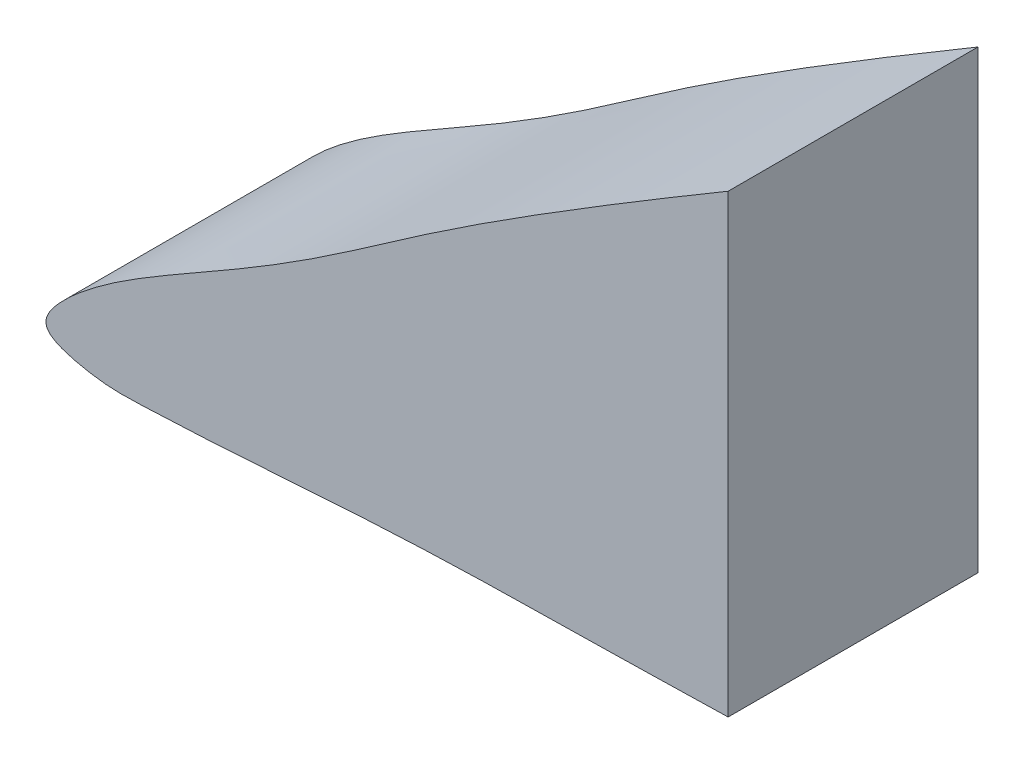
ISO-10303-21;
HEADER;
FILE_DESCRIPTION(('STEP AP214'),'2;1');
FILE_NAME('part.step','',(''),(''),'','','');
FILE_SCHEMA(('AUTOMOTIVE_DESIGN { 1 0 10303 214 1 1 1 1 }'));
ENDSEC;
DATA;
#1=APPLICATION_CONTEXT('core data for automotive mechanical design processes');
#2=APPLICATION_PROTOCOL_DEFINITION('international standard','automotive_design',2000,#1);
#3=PRODUCT_CONTEXT('',#1,'mechanical');
#4=PRODUCT('Part','Part','',(#3));
#5=PRODUCT_RELATED_PRODUCT_CATEGORY('part','',(#4));
#6=PRODUCT_DEFINITION_FORMATION('','',#4);
#7=PRODUCT_DEFINITION_CONTEXT('part definition',#1,'design');
#8=PRODUCT_DEFINITION('design','',#6,#7);
#9=PRODUCT_DEFINITION_SHAPE('','',#8);
#10=(LENGTH_UNIT() NAMED_UNIT(*) SI_UNIT(.MILLI.,.METRE.));
#11=(NAMED_UNIT(*) PLANE_ANGLE_UNIT() SI_UNIT($,.RADIAN.));
#12=(NAMED_UNIT(*) SI_UNIT($,.STERADIAN.) SOLID_ANGLE_UNIT());
#13=UNCERTAINTY_MEASURE_WITH_UNIT(LENGTH_MEASURE(1.E-05),#10,'distance_accuracy_value','');
#14=(GEOMETRIC_REPRESENTATION_CONTEXT(3) GLOBAL_UNCERTAINTY_ASSIGNED_CONTEXT((#13)) GLOBAL_UNIT_ASSIGNED_CONTEXT((#10,
#11,#12)) REPRESENTATION_CONTEXT('',''));
#15=CARTESIAN_POINT('',(0.,0.,0.));
#16=DIRECTION('',(0.,0.,1.));
#17=DIRECTION('',(1.,0.,0.));
#18=AXIS2_PLACEMENT_3D('',#15,#16,#17);
#19=CARTESIAN_POINT('',(-64.0491892275269,-108.941956320283,59.9999999999997));
#20=CARTESIAN_POINT('',(-64.916814073584,-109.453491194074,59.9999999999997));
#21=CARTESIAN_POINT('',(-65.7813275878161,-109.969977799597,59.9999999999997));
#22=CARTESIAN_POINT('',(-67.5059803143799,-111.00991277838,59.9999999999997));
#23=CARTESIAN_POINT('',(-68.3658374650965,-111.533810056975,59.9999999999997));
#24=CARTESIAN_POINT('',(-70.077149004939,-112.594977736525,59.9999999999997));
#25=CARTESIAN_POINT('',(-70.9285996781756,-113.132254051375,59.9999999999997));
#26=CARTESIAN_POINT('',(-72.6186735071897,-114.227221869428,59.9999999999997));
#27=CARTESIAN_POINT('',(-73.4561361562248,-114.786760336692,59.9999999999997));
#28=CARTESIAN_POINT('',(-75.113512478323,-115.933766732321,59.9999999999997));
#29=CARTESIAN_POINT('',(-75.936327199912,-116.516508625601,59.9999999999997));
#30=CARTESIAN_POINT('',(-77.6085762756817,-117.640547366462,59.9999999999997));
#31=CARTESIAN_POINT('',(-78.4593205614324,-118.179866972095,59.9999999999997));
#32=CARTESIAN_POINT('',(-80.1897537733933,-119.21356446914,59.9999999999997));
#33=CARTESIAN_POINT('',(-81.0710976002097,-119.705122828762,59.9999999999997));
#34=CARTESIAN_POINT('',(-82.3775778295748,-120.466978939285,59.9999999999997));
#35=CARTESIAN_POINT('',(-82.8103361921758,-120.725289274037,59.9999999999997));
#36=CARTESIAN_POINT('',(-83.6592446702396,-121.268375186674,59.9999999999997));
#37=CARTESIAN_POINT('',(-84.0754865345503,-121.553004562763,59.9999999999997));
#38=CARTESIAN_POINT('',(-84.6737184874888,-122.021588128134,59.9999999999997));
#39=CARTESIAN_POINT('',(-84.8703679468466,-122.182939407663,59.9999999999997));
#40=CARTESIAN_POINT('',(-85.1510311936891,-122.438363205277,59.9999999999997));
#41=CARTESIAN_POINT('',(-85.2424660005515,-122.525653926869,59.9999999999997));
#42=CARTESIAN_POINT('',(-85.4206592566678,-122.704977577126,59.9999999999997));
#43=CARTESIAN_POINT('',(-85.5078078528504,-122.796614865064,59.9999999999997));
#44=CARTESIAN_POINT('',(-85.6705924448503,-122.991564154349,59.9999999999997));
#45=CARTESIAN_POINT('',(-85.7473201590252,-123.095376469857,59.9999999999997));
#46=CARTESIAN_POINT('',(-85.8376425837549,-123.263504927186,59.9999999999997));
#47=CARTESIAN_POINT('',(-85.8637721744491,-123.323051186106,59.9999999999997));
#48=CARTESIAN_POINT('',(-85.8936989115167,-123.447832598768,59.9999999999997));
#49=CARTESIAN_POINT('',(-85.8966335226402,-123.514140200892,59.9999999999997));
#50=CARTESIAN_POINT('',(-85.8623586589721,-123.638423954834,59.9999999999997));
#51=CARTESIAN_POINT('',(-85.8249309001778,-123.693987859988,59.9999999999997));
#52=CARTESIAN_POINT('',(-85.7341024403552,-123.784642841872,59.9999999999997));
#53=CARTESIAN_POINT('',(-85.6804287747307,-123.821727387187,59.9999999999997));
#54=CARTESIAN_POINT('',(-85.5149462709032,-123.918656347732,59.9999999999997));
#55=CARTESIAN_POINT('',(-85.396125066846,-123.965158764815,59.9999999999997));
#56=CARTESIAN_POINT('',(-85.0315748969899,-124.08703717668,59.9999999999997));
#57=CARTESIAN_POINT('',(-84.7824685177842,-124.141857592444,59.9999999999997));
#58=CARTESIAN_POINT('',(-84.2793684815052,-124.230227014204,59.9999999999997));
#59=CARTESIAN_POINT('',(-84.0257091889579,-124.261149537343,59.9999999999997));
#60=CARTESIAN_POINT('',(-83.5200958548092,-124.286085759742,59.9999999999997));
#61=CARTESIAN_POINT('',(-83.2672745269978,-124.281585487117,59.9999999999997));
#62=CARTESIAN_POINT('',(-82.761626016437,-124.265808418186,59.9999999999997));
#63=CARTESIAN_POINT('',(-82.508799109645,-124.254851015614,59.9999999999997));
#64=CARTESIAN_POINT('',(-81.2446651554317,-124.200735003958,59.9999999999997));
#65=CARTESIAN_POINT('',(-80.2335329201732,-124.145332867247,59.9999999999997));
#66=CARTESIAN_POINT('',(-78.2133398074332,-124.00719022459,59.9999999999997));
#67=CARTESIAN_POINT('',(-77.2037237920855,-123.930073191889,59.9999999999997));
#68=CARTESIAN_POINT('',(-75.1826080755178,-123.807377730152,59.9999999999997));
#69=CARTESIAN_POINT('',(-74.1711395759086,-123.759161192513,59.9999999999997));
#70=CARTESIAN_POINT('',(-72.1473051377897,-123.687981536664,59.9999999999997));
#71=CARTESIAN_POINT('',(-71.1350977170758,-123.66487524093,59.9999999999997));
#72=CARTESIAN_POINT('',(-69.1104865151344,-123.627109440707,59.9999999999997));
#73=CARTESIAN_POINT('',(-68.0980884825346,-123.612202648936,59.9999999999997));
#74=CARTESIAN_POINT('',(-66.0735260712704,-123.572338032324,59.9999999999997));
#75=CARTESIAN_POINT('',(-65.06134455714,-123.548117319549,59.9999999999997));
#76=CARTESIAN_POINT('',(-64.0491892275145,-123.522770234457,59.9999999999997));
#77=B_SPLINE_CURVE_WITH_KNOTS('',3,(#19,#20,#21,#22,#23,#24,#25,#26,#27,#28,#29,#30,#31,#32,#33,
#34,#35,#36,#37,#38,#39,#40,#41,#42,#43,#44,#45,#46,#47,#48,#49,#50,#51,#52,#53,#54,#55,#56,#57,
#58,#59,#60,#61,#62,#63,#64,#65,#66,#67,#68,#69,#70,#71,#72,#73,#74,#75,#76),.UNSPECIFIED.,.F.,
.F.,(4,2,2,2,2,2,2,2,2,2,2,2,2,2,2,2,2,2,2,2,2,2,2,2,2,2,2,2,4),(0.,0.0624999999999942,
0.124999999999989,0.187499999999983,0.249999999999977,0.312499999999971,0.374999999999966,
0.43749999999996,0.468749999999957,0.499999999999954,0.515624999999953,0.523437499999952,
0.531249999999952,0.539062499999952,0.542968749999952,0.546874999999952,0.550781249999952,
0.554687499999952,0.562499999999952,0.578124999999954,0.593749999999955,0.609374999999956,
0.624999999999958,0.687499999999965,0.749999999999972,0.812499999999979,0.874999999999986,
0.937499999999993,1.),.UNSPECIFIED.);
#78=DIRECTION('',(0.,0.,-1.));
#79=VECTOR('',#78,1.);
#80=SURFACE_OF_LINEAR_EXTRUSION('',#77,#79);
#81=CARTESIAN_POINT('',(-64.0491892275269,-108.941956320283,51.9999999999998));
#82=CARTESIAN_POINT('',(-64.916814073584,-109.453491194074,51.9999999999998));
#83=CARTESIAN_POINT('',(-65.7813275878161,-109.969977799597,51.9999999999998));
#84=CARTESIAN_POINT('',(-67.5059803143799,-111.00991277838,51.9999999999998));
#85=CARTESIAN_POINT('',(-68.3658374650965,-111.533810056975,51.9999999999998));
#86=CARTESIAN_POINT('',(-70.077149004939,-112.594977736525,51.9999999999998));
#87=CARTESIAN_POINT('',(-70.9285996781756,-113.132254051375,51.9999999999998));
#88=CARTESIAN_POINT('',(-72.6186735071897,-114.227221869428,51.9999999999998));
#89=CARTESIAN_POINT('',(-73.4561361562248,-114.786760336692,51.9999999999998));
#90=CARTESIAN_POINT('',(-75.113512478323,-115.933766732321,51.9999999999998));
#91=CARTESIAN_POINT('',(-75.936327199912,-116.516508625601,51.9999999999998));
#92=CARTESIAN_POINT('',(-77.6085762756817,-117.640547366462,51.9999999999998));
#93=CARTESIAN_POINT('',(-78.4593205614324,-118.179866972095,51.9999999999998));
#94=CARTESIAN_POINT('',(-80.1897537733933,-119.21356446914,51.9999999999998));
#95=CARTESIAN_POINT('',(-81.0710976002097,-119.705122828762,51.9999999999998));
#96=CARTESIAN_POINT('',(-82.3775778295748,-120.466978939285,51.9999999999998));
#97=CARTESIAN_POINT('',(-82.8103361921758,-120.725289274037,51.9999999999998));
#98=CARTESIAN_POINT('',(-83.6592446702396,-121.268375186674,51.9999999999998));
#99=CARTESIAN_POINT('',(-84.0754865345503,-121.553004562763,51.9999999999998));
#100=CARTESIAN_POINT('',(-84.6737184874888,-122.021588128134,51.9999999999998));
#101=CARTESIAN_POINT('',(-84.8703679468466,-122.182939407663,51.9999999999998));
#102=CARTESIAN_POINT('',(-85.1510311936891,-122.438363205277,51.9999999999998));
#103=CARTESIAN_POINT('',(-85.2424660005515,-122.525653926869,51.9999999999998));
#104=CARTESIAN_POINT('',(-85.4206592566678,-122.704977577126,51.9999999999998));
#105=CARTESIAN_POINT('',(-85.5078078528504,-122.796614865064,51.9999999999998));
#106=CARTESIAN_POINT('',(-85.6705924448503,-122.991564154349,51.9999999999998));
#107=CARTESIAN_POINT('',(-85.7473201590252,-123.095376469857,51.9999999999998));
#108=CARTESIAN_POINT('',(-85.8376425837549,-123.263504927186,51.9999999999998));
#109=CARTESIAN_POINT('',(-85.8637721744491,-123.323051186106,51.9999999999998));
#110=CARTESIAN_POINT('',(-85.8936989115167,-123.447832598768,51.9999999999998));
#111=CARTESIAN_POINT('',(-85.8966335226402,-123.514140200892,51.9999999999998));
#112=CARTESIAN_POINT('',(-85.8623586589721,-123.638423954834,51.9999999999998));
#113=CARTESIAN_POINT('',(-85.8249309001778,-123.693987859988,51.9999999999998));
#114=CARTESIAN_POINT('',(-85.7341024403552,-123.784642841872,51.9999999999998));
#115=CARTESIAN_POINT('',(-85.6804287747307,-123.821727387187,51.9999999999998));
#116=CARTESIAN_POINT('',(-85.5149462709032,-123.918656347732,51.9999999999998));
#117=CARTESIAN_POINT('',(-85.396125066846,-123.965158764815,51.9999999999998));
#118=CARTESIAN_POINT('',(-85.0315748969899,-124.08703717668,51.9999999999998));
#119=CARTESIAN_POINT('',(-84.7824685177842,-124.141857592444,51.9999999999998));
#120=CARTESIAN_POINT('',(-84.2793684815052,-124.230227014204,51.9999999999998));
#121=CARTESIAN_POINT('',(-84.0257091889579,-124.261149537343,51.9999999999998));
#122=CARTESIAN_POINT('',(-83.5200958548092,-124.286085759742,51.9999999999998));
#123=CARTESIAN_POINT('',(-83.2672745269978,-124.281585487117,51.9999999999998));
#124=CARTESIAN_POINT('',(-82.761626016437,-124.265808418186,51.9999999999998));
#125=CARTESIAN_POINT('',(-82.508799109645,-124.254851015614,51.9999999999998));
#126=CARTESIAN_POINT('',(-81.2446651554317,-124.200735003958,51.9999999999998));
#127=CARTESIAN_POINT('',(-80.2335329201732,-124.145332867247,51.9999999999998));
#128=CARTESIAN_POINT('',(-78.2133398074332,-124.00719022459,51.9999999999998));
#129=CARTESIAN_POINT('',(-77.2037237920855,-123.930073191889,51.9999999999998));
#130=CARTESIAN_POINT('',(-75.1826080755178,-123.807377730152,51.9999999999998));
#131=CARTESIAN_POINT('',(-74.1711395759086,-123.759161192513,51.9999999999998));
#132=CARTESIAN_POINT('',(-72.1473051377897,-123.687981536664,51.9999999999998));
#133=CARTESIAN_POINT('',(-71.1350977170758,-123.66487524093,51.9999999999998));
#134=CARTESIAN_POINT('',(-69.1104865151344,-123.627109440707,51.9999999999998));
#135=CARTESIAN_POINT('',(-68.0980884825346,-123.612202648936,51.9999999999998));
#136=CARTESIAN_POINT('',(-66.0735260712704,-123.572338032324,51.9999999999998));
#137=CARTESIAN_POINT('',(-65.06134455714,-123.548117319549,51.9999999999998));
#138=CARTESIAN_POINT('',(-64.0491892275145,-123.522770234457,51.9999999999998));
#139=B_SPLINE_CURVE_WITH_KNOTS('',3,(#81,#82,#83,#84,#85,#86,#87,#88,#89,#90,#91,#92,#93,#94,
#95,#96,#97,#98,#99,#100,#101,#102,#103,#104,#105,#106,#107,#108,#109,#110,#111,#112,#113,#114,
#115,#116,#117,#118,#119,#120,#121,#122,#123,#124,#125,#126,#127,#128,#129,#130,#131,#132,#133,
#134,#135,#136,#137,#138),.UNSPECIFIED.,.F.,.F.,(4,2,2,2,2,2,2,2,2,2,2,2,2,2,2,2,2,2,2,2,2,2,2,
2,2,2,2,2,4),(0.,0.0624999999999942,0.124999999999989,0.187499999999983,0.249999999999977,
0.312499999999971,0.374999999999966,0.43749999999996,0.468749999999957,0.499999999999954,
0.515624999999953,0.523437499999952,0.531249999999952,0.539062499999952,0.542968749999952,
0.546874999999952,0.550781249999952,0.554687499999952,0.562499999999952,0.578124999999954,
0.593749999999955,0.609374999999956,0.624999999999958,0.687499999999965,0.749999999999972,
0.812499999999979,0.874999999999986,0.937499999999993,1.),.UNSPECIFIED.);
#140=CARTESIAN_POINT('',(-64.049189227515,-108.941956320276,51.9999999999997));
#141=VERTEX_POINT('',#140);
#142=CARTESIAN_POINT('',(-64.0491892275151,-123.522770234457,51.9999999999997));
#143=VERTEX_POINT('',#142);
#144=EDGE_CURVE('E65',#141,#143,#139,.T.);
#145=ORIENTED_EDGE('',*,*,#144,.T.);
#146=DIRECTION('',(0.,0.,-1.));
#147=VECTOR('',#146,1.);
#148=CARTESIAN_POINT('',(-64.0491892275151,-123.522770234457,59.9999999999997));
#149=LINE('',#148,#147);
#150=CARTESIAN_POINT('',(-64.0491892275151,-123.522770234457,59.9999999999997));
#151=VERTEX_POINT('',#150);
#152=EDGE_CURVE('E11',#151,#143,#149,.T.);
#153=ORIENTED_EDGE('',*,*,#152,.F.);
#154=CARTESIAN_POINT('',(-64.0491892275145,-123.522770234457,59.9999999999997));
#155=CARTESIAN_POINT('',(-65.06134455714,-123.548117319549,59.9999999999997));
#156=CARTESIAN_POINT('',(-66.0735260712704,-123.572338032324,59.9999999999997));
#157=CARTESIAN_POINT('',(-68.0980884825346,-123.612202648936,59.9999999999997));
#158=CARTESIAN_POINT('',(-69.1104865151344,-123.627109440707,59.9999999999997));
#159=CARTESIAN_POINT('',(-71.1350977170758,-123.66487524093,59.9999999999997));
#160=CARTESIAN_POINT('',(-72.1473051377897,-123.687981536664,59.9999999999997));
#161=CARTESIAN_POINT('',(-74.1711395759086,-123.759161192513,59.9999999999997));
#162=CARTESIAN_POINT('',(-75.1826080755178,-123.807377730152,59.9999999999997));
#163=CARTESIAN_POINT('',(-77.2037237920855,-123.930073191889,59.9999999999997));
#164=CARTESIAN_POINT('',(-78.2133398074332,-124.00719022459,59.9999999999997));
#165=CARTESIAN_POINT('',(-80.2335329201732,-124.145332867247,59.9999999999997));
#166=CARTESIAN_POINT('',(-81.2446651554317,-124.200735003958,59.9999999999997));
#167=CARTESIAN_POINT('',(-82.508799109645,-124.254851015614,59.9999999999997));
#168=CARTESIAN_POINT('',(-82.761626016437,-124.265808418186,59.9999999999997));
#169=CARTESIAN_POINT('',(-83.2672745269978,-124.281585487117,59.9999999999997));
#170=CARTESIAN_POINT('',(-83.5200958548092,-124.286085759742,59.9999999999997));
#171=CARTESIAN_POINT('',(-84.0257091889579,-124.261149537343,59.9999999999997));
#172=CARTESIAN_POINT('',(-84.2793684815052,-124.230227014204,59.9999999999997));
#173=CARTESIAN_POINT('',(-84.7824685177842,-124.141857592444,59.9999999999997));
#174=CARTESIAN_POINT('',(-85.0315748969899,-124.08703717668,59.9999999999997));
#175=CARTESIAN_POINT('',(-85.396125066846,-123.965158764815,59.9999999999997));
#176=CARTESIAN_POINT('',(-85.5149462709032,-123.918656347732,59.9999999999997));
#177=CARTESIAN_POINT('',(-85.6804287747307,-123.821727387187,59.9999999999997));
#178=CARTESIAN_POINT('',(-85.7341024403552,-123.784642841872,59.9999999999997));
#179=CARTESIAN_POINT('',(-85.8249309001778,-123.693987859988,59.9999999999997));
#180=CARTESIAN_POINT('',(-85.8623586589721,-123.638423954834,59.9999999999997));
#181=CARTESIAN_POINT('',(-85.8966335226402,-123.514140200892,59.9999999999997));
#182=CARTESIAN_POINT('',(-85.8936989115167,-123.447832598768,59.9999999999997));
#183=CARTESIAN_POINT('',(-85.8637721744491,-123.323051186106,59.9999999999997));
#184=CARTESIAN_POINT('',(-85.8376425837549,-123.263504927186,59.9999999999997));
#185=CARTESIAN_POINT('',(-85.7473201590252,-123.095376469857,59.9999999999997));
#186=CARTESIAN_POINT('',(-85.6705924448503,-122.991564154349,59.9999999999997));
#187=CARTESIAN_POINT('',(-85.5078078528504,-122.796614865064,59.9999999999997));
#188=CARTESIAN_POINT('',(-85.4206592566678,-122.704977577126,59.9999999999997));
#189=CARTESIAN_POINT('',(-85.2424660005515,-122.525653926869,59.9999999999997));
#190=CARTESIAN_POINT('',(-85.1510311936891,-122.438363205277,59.9999999999997));
#191=CARTESIAN_POINT('',(-84.8703679468466,-122.182939407663,59.9999999999997));
#192=CARTESIAN_POINT('',(-84.6737184874888,-122.021588128134,59.9999999999997));
#193=CARTESIAN_POINT('',(-84.0754865345503,-121.553004562763,59.9999999999997));
#194=CARTESIAN_POINT('',(-83.6592446702396,-121.268375186674,59.9999999999997));
#195=CARTESIAN_POINT('',(-82.8103361921758,-120.725289274037,59.9999999999997));
#196=CARTESIAN_POINT('',(-82.3775778295748,-120.466978939285,59.9999999999997));
#197=CARTESIAN_POINT('',(-81.0710976002097,-119.705122828762,59.9999999999997));
#198=CARTESIAN_POINT('',(-80.1897537733933,-119.21356446914,59.9999999999997));
#199=CARTESIAN_POINT('',(-78.4593205614324,-118.179866972095,59.9999999999997));
#200=CARTESIAN_POINT('',(-77.6085762756817,-117.640547366462,59.9999999999997));
#201=CARTESIAN_POINT('',(-75.936327199912,-116.516508625601,59.9999999999997));
#202=CARTESIAN_POINT('',(-75.113512478323,-115.933766732321,59.9999999999997));
#203=CARTESIAN_POINT('',(-73.4561361562248,-114.786760336692,59.9999999999997));
#204=CARTESIAN_POINT('',(-72.6186735071897,-114.227221869428,59.9999999999997));
#205=CARTESIAN_POINT('',(-70.9285996781756,-113.132254051375,59.9999999999997));
#206=CARTESIAN_POINT('',(-70.077149004939,-112.594977736525,59.9999999999997));
#207=CARTESIAN_POINT('',(-68.3658374650965,-111.533810056975,59.9999999999997));
#208=CARTESIAN_POINT('',(-67.5059803143799,-111.00991277838,59.9999999999997));
#209=CARTESIAN_POINT('',(-65.7813275878161,-109.969977799597,59.9999999999997));
#210=CARTESIAN_POINT('',(-64.916814073584,-109.453491194074,59.9999999999997));
#211=CARTESIAN_POINT('',(-64.0491892275269,-108.941956320283,59.9999999999997));
#212=B_SPLINE_CURVE_WITH_KNOTS('',3,(#154,#155,#156,#157,#158,#159,#160,#161,#162,#163,#164,
#165,#166,#167,#168,#169,#170,#171,#172,#173,#174,#175,#176,#177,#178,#179,#180,#181,#182,#183,
#184,#185,#186,#187,#188,#189,#190,#191,#192,#193,#194,#195,#196,#197,#198,#199,#200,#201,#202,
#203,#204,#205,#206,#207,#208,#209,#210,#211),.UNSPECIFIED.,.F.,.F.,(4,2,2,2,2,2,2,2,2,2,2,2,2,
2,2,2,2,2,2,2,2,2,2,2,2,2,2,2,4),(0.,0.0625000000000071,0.125000000000014,0.187500000000021,
0.250000000000028,0.312500000000035,0.375000000000042,0.390625000000044,0.406250000000045,
0.421875000000046,0.437500000000048,0.445312500000048,0.449218750000048,0.453125000000048,
0.457031250000048,0.460937500000048,0.468750000000048,0.476562500000048,0.484375000000047,
0.500000000000046,0.531250000000043,0.56250000000004,0.625000000000034,0.687500000000029,
0.750000000000023,0.812500000000017,0.875000000000011,0.937500000000006,1.),.UNSPECIFIED.);
#213=CARTESIAN_POINT('',(-64.049189227515,-108.941956320276,59.9999999999997));
#214=VERTEX_POINT('',#213);
#215=EDGE_CURVE('E64',#214,#151,#212,.F.);
#216=ORIENTED_EDGE('',*,*,#215,.F.);
#217=DIRECTION('',(0.,0.,-1.));
#218=VECTOR('',#217,1.);
#219=CARTESIAN_POINT('',(-64.049189227515,-108.941956320276,59.9999999999997));
#220=LINE('',#219,#218);
#221=EDGE_CURVE('E41',#214,#141,#220,.T.);
#222=ORIENTED_EDGE('',*,*,#221,.T.);
#223=EDGE_LOOP('',(#145,#153,#216,#222));
#224=FACE_BOUND('',#223,.T.);
#225=ADVANCED_FACE('F30',(#224),#80,.F.);
#226=CARTESIAN_POINT('',(-64.049189227515,-108.941956320276,59.9999999999997));
#227=DIRECTION('',(-1.,0.,0.));
#228=DIRECTION('',(0.,-1.,0.));
#229=AXIS2_PLACEMENT_3D('',#226,#227,#228);
#230=PLANE('',#229);
#231=DIRECTION('',(0.,1.,0.));
#232=VECTOR('',#231,1.);
#233=CARTESIAN_POINT('',(-64.049189227515,-108.941956320276,51.9999999999997));
#234=LINE('',#233,#232);
#235=EDGE_CURVE('E57',#143,#141,#234,.T.);
#236=ORIENTED_EDGE('',*,*,#235,.T.);
#237=ORIENTED_EDGE('',*,*,#221,.F.);
#238=DIRECTION('',(0.,1.,0.));
#239=VECTOR('',#238,1.);
#240=CARTESIAN_POINT('',(-64.049189227515,-108.941956320276,59.9999999999997));
#241=LINE('',#240,#239);
#242=EDGE_CURVE('E49',#151,#214,#241,.T.);
#243=ORIENTED_EDGE('',*,*,#242,.F.);
#244=ORIENTED_EDGE('',*,*,#152,.T.);
#245=EDGE_LOOP('',(#236,#237,#243,#244));
#246=FACE_BOUND('',#245,.T.);
#247=ADVANCED_FACE('F60',(#246),#230,.F.);
#248=CARTESIAN_POINT('',(-84.474307836511,-121.865393606345,59.9999999999997));
#249=DIRECTION('',(0.,0.,1.));
#250=DIRECTION('',(1.,0.,0.));
#251=AXIS2_PLACEMENT_3D('',#248,#249,#250);
#252=PLANE('',#251);
#253=ORIENTED_EDGE('',*,*,#215,.T.);
#254=ORIENTED_EDGE('',*,*,#242,.T.);
#255=EDGE_LOOP('',(#253,#254));
#256=FACE_BOUND('',#255,.T.);
#257=ADVANCED_FACE('F87',(#256),#252,.T.);
#258=CARTESIAN_POINT('',(-84.474307836511,-121.865393606345,51.9999999999997));
#259=DIRECTION('',(0.,0.,1.));
#260=DIRECTION('',(1.,0.,0.));
#261=AXIS2_PLACEMENT_3D('',#258,#259,#260);
#262=PLANE('',#261);
#263=ORIENTED_EDGE('',*,*,#144,.F.);
#264=ORIENTED_EDGE('',*,*,#235,.F.);
#265=EDGE_LOOP('',(#263,#264));
#266=FACE_BOUND('',#265,.T.);
#267=ADVANCED_FACE('F71',(#266),#262,.F.);
#268=CLOSED_SHELL('',(#225,#247,#257,#267));
#269=MANIFOLD_SOLID_BREP('B2',#268);
#270=ADVANCED_BREP_SHAPE_REPRESENTATION('',(#18,#269),#14);
#271=SHAPE_DEFINITION_REPRESENTATION(#9,#270);
ENDSEC;
END-ISO-10303-21;
